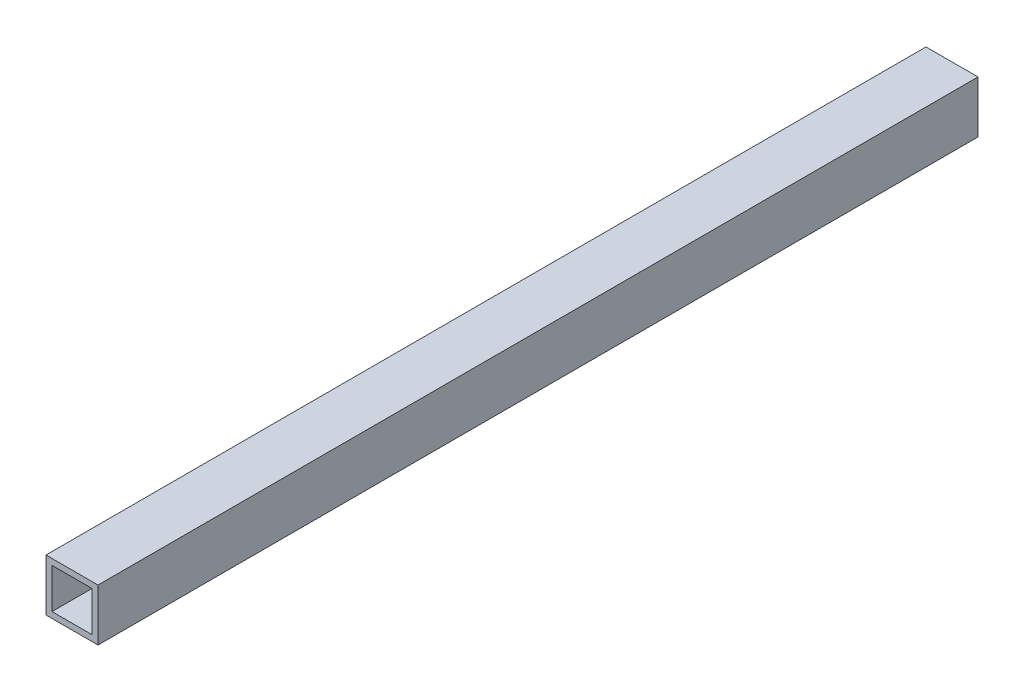
ISO-10303-21;
HEADER;
FILE_DESCRIPTION(('STEP AP214'),'2;1');
FILE_NAME('part.step','',(''),(''),'','','');
FILE_SCHEMA(('AUTOMOTIVE_DESIGN { 1 0 10303 214 1 1 1 1 }'));
ENDSEC;
DATA;
#1=APPLICATION_CONTEXT('core data for automotive mechanical design processes');
#2=APPLICATION_PROTOCOL_DEFINITION('international standard','automotive_design',2000,#1);
#3=PRODUCT_CONTEXT('',#1,'mechanical');
#4=PRODUCT('Part','Part','',(#3));
#5=PRODUCT_RELATED_PRODUCT_CATEGORY('part','',(#4));
#6=PRODUCT_DEFINITION_FORMATION('','',#4);
#7=PRODUCT_DEFINITION_CONTEXT('part definition',#1,'design');
#8=PRODUCT_DEFINITION('design','',#6,#7);
#9=PRODUCT_DEFINITION_SHAPE('','',#8);
#10=(LENGTH_UNIT() NAMED_UNIT(*) SI_UNIT(.MILLI.,.METRE.));
#11=(NAMED_UNIT(*) PLANE_ANGLE_UNIT() SI_UNIT($,.RADIAN.));
#12=(NAMED_UNIT(*) SI_UNIT($,.STERADIAN.) SOLID_ANGLE_UNIT());
#13=UNCERTAINTY_MEASURE_WITH_UNIT(LENGTH_MEASURE(1.E-05),#10,'distance_accuracy_value','');
#14=(GEOMETRIC_REPRESENTATION_CONTEXT(3) GLOBAL_UNCERTAINTY_ASSIGNED_CONTEXT((#13)) GLOBAL_UNIT_ASSIGNED_CONTEXT((#10,
#11,#12)) REPRESENTATION_CONTEXT('',''));
#15=CARTESIAN_POINT('',(0.,0.,0.));
#16=DIRECTION('',(0.,0.,1.));
#17=DIRECTION('',(1.,0.,0.));
#18=AXIS2_PLACEMENT_3D('',#15,#16,#17);
#19=CARTESIAN_POINT('',(0.,0.,220.));
#20=DIRECTION('',(0.,0.,1.));
#21=DIRECTION('',(1.,0.,0.));
#22=AXIS2_PLACEMENT_3D('',#19,#20,#21);
#23=PLANE('',#22);
#24=DIRECTION('',(0.,1.,0.));
#25=VECTOR('',#24,1.);
#26=CARTESIAN_POINT('',(6.5,6.5,220.));
#27=LINE('',#26,#25);
#28=CARTESIAN_POINT('',(6.5,-6.5,220.));
#29=VERTEX_POINT('',#28);
#30=CARTESIAN_POINT('',(6.5,6.5,220.));
#31=VERTEX_POINT('',#30);
#32=EDGE_CURVE('E136',#29,#31,#27,.T.);
#33=ORIENTED_EDGE('',*,*,#32,.T.);
#34=DIRECTION('',(-1.,0.,0.));
#35=VECTOR('',#34,1.);
#36=CARTESIAN_POINT('',(-6.5,6.5,220.));
#37=LINE('',#36,#35);
#38=CARTESIAN_POINT('',(-6.5,6.5,220.));
#39=VERTEX_POINT('',#38);
#40=EDGE_CURVE('E139',#31,#39,#37,.T.);
#41=ORIENTED_EDGE('',*,*,#40,.T.);
#42=DIRECTION('',(0.,-1.,0.));
#43=VECTOR('',#42,1.);
#44=CARTESIAN_POINT('',(-6.5,6.5,220.));
#45=LINE('',#44,#43);
#46=CARTESIAN_POINT('',(-6.5,-6.5,220.));
#47=VERTEX_POINT('',#46);
#48=EDGE_CURVE('E142',#39,#47,#45,.T.);
#49=ORIENTED_EDGE('',*,*,#48,.T.);
#50=DIRECTION('',(1.,0.,0.));
#51=VECTOR('',#50,1.);
#52=CARTESIAN_POINT('',(-6.5,-6.5,220.));
#53=LINE('',#52,#51);
#54=EDGE_CURVE('E144',#47,#29,#53,.T.);
#55=ORIENTED_EDGE('',*,*,#54,.T.);
#56=EDGE_LOOP('',(#33,#41,#49,#55));
#57=FACE_BOUND('',#56,.T.);
#58=DIRECTION('',(-1.,0.,0.));
#59=VECTOR('',#58,1.);
#60=CARTESIAN_POINT('',(-5.,5.00000000000001,220.));
#61=LINE('',#60,#59);
#62=CARTESIAN_POINT('',(5.,5.00000000000001,220.));
#63=VERTEX_POINT('',#62);
#64=CARTESIAN_POINT('',(-5.,5.00000000000001,220.));
#65=VERTEX_POINT('',#64);
#66=EDGE_CURVE('E108',#63,#65,#61,.T.);
#67=ORIENTED_EDGE('',*,*,#66,.F.);
#68=DIRECTION('',(0.,1.,0.));
#69=VECTOR('',#68,1.);
#70=CARTESIAN_POINT('',(5.,-5.,220.));
#71=LINE('',#70,#69);
#72=CARTESIAN_POINT('',(5.,-5.,220.));
#73=VERTEX_POINT('',#72);
#74=EDGE_CURVE('E100',#73,#63,#71,.T.);
#75=ORIENTED_EDGE('',*,*,#74,.F.);
#76=DIRECTION('',(1.,0.,0.));
#77=VECTOR('',#76,1.);
#78=CARTESIAN_POINT('',(-5.,-5.,220.));
#79=LINE('',#78,#77);
#80=CARTESIAN_POINT('',(-5.,-5.,220.));
#81=VERTEX_POINT('',#80);
#82=EDGE_CURVE('E122',#81,#73,#79,.T.);
#83=ORIENTED_EDGE('',*,*,#82,.F.);
#84=DIRECTION('',(0.,-1.,0.));
#85=VECTOR('',#84,1.);
#86=CARTESIAN_POINT('',(-5.,-5.,220.));
#87=LINE('',#86,#85);
#88=EDGE_CURVE('E120',#65,#81,#87,.T.);
#89=ORIENTED_EDGE('',*,*,#88,.F.);
#90=EDGE_LOOP('',(#67,#75,#83,#89));
#91=FACE_BOUND('',#90,.T.);
#92=ADVANCED_FACE('F35',(#57,#91),#23,.T.);
#93=CARTESIAN_POINT('',(0.,0.,0.));
#94=DIRECTION('',(0.,0.,1.));
#95=DIRECTION('',(1.,0.,0.));
#96=AXIS2_PLACEMENT_3D('',#93,#94,#95);
#97=PLANE('',#96);
#98=DIRECTION('',(0.,1.,0.));
#99=VECTOR('',#98,1.);
#100=CARTESIAN_POINT('',(6.5,6.5,0.));
#101=LINE('',#100,#99);
#102=CARTESIAN_POINT('',(6.5,-6.5,0.));
#103=VERTEX_POINT('',#102);
#104=CARTESIAN_POINT('',(6.5,6.5,0.));
#105=VERTEX_POINT('',#104);
#106=EDGE_CURVE('E116',#103,#105,#101,.T.);
#107=ORIENTED_EDGE('',*,*,#106,.F.);
#108=DIRECTION('',(1.,0.,0.));
#109=VECTOR('',#108,1.);
#110=CARTESIAN_POINT('',(-6.5,-6.5,0.));
#111=LINE('',#110,#109);
#112=CARTESIAN_POINT('',(-6.5,-6.5,0.));
#113=VERTEX_POINT('',#112);
#114=EDGE_CURVE('E140',#113,#103,#111,.T.);
#115=ORIENTED_EDGE('',*,*,#114,.F.);
#116=DIRECTION('',(0.,-1.,0.));
#117=VECTOR('',#116,1.);
#118=CARTESIAN_POINT('',(-6.5,6.5,0.));
#119=LINE('',#118,#117);
#120=CARTESIAN_POINT('',(-6.5,6.5,0.));
#121=VERTEX_POINT('',#120);
#122=EDGE_CURVE('E151',#121,#113,#119,.T.);
#123=ORIENTED_EDGE('',*,*,#122,.F.);
#124=DIRECTION('',(-1.,0.,0.));
#125=VECTOR('',#124,1.);
#126=CARTESIAN_POINT('',(-6.5,6.5,0.));
#127=LINE('',#126,#125);
#128=EDGE_CURVE('E149',#105,#121,#127,.T.);
#129=ORIENTED_EDGE('',*,*,#128,.F.);
#130=EDGE_LOOP('',(#107,#115,#123,#129));
#131=FACE_BOUND('',#130,.T.);
#132=DIRECTION('',(0.,1.,0.));
#133=VECTOR('',#132,1.);
#134=CARTESIAN_POINT('',(5.,-5.,0.));
#135=LINE('',#134,#133);
#136=CARTESIAN_POINT('',(5.,-5.,0.));
#137=VERTEX_POINT('',#136);
#138=CARTESIAN_POINT('',(5.,5.00000000000001,0.));
#139=VERTEX_POINT('',#138);
#140=EDGE_CURVE('E58',#137,#139,#135,.T.);
#141=ORIENTED_EDGE('',*,*,#140,.T.);
#142=DIRECTION('',(-1.,0.,0.));
#143=VECTOR('',#142,1.);
#144=CARTESIAN_POINT('',(-5.,5.00000000000001,0.));
#145=LINE('',#144,#143);
#146=CARTESIAN_POINT('',(-5.,5.00000000000001,0.));
#147=VERTEX_POINT('',#146);
#148=EDGE_CURVE('E115',#139,#147,#145,.T.);
#149=ORIENTED_EDGE('',*,*,#148,.T.);
#150=DIRECTION('',(0.,-1.,0.));
#151=VECTOR('',#150,1.);
#152=CARTESIAN_POINT('',(-5.,-5.,0.));
#153=LINE('',#152,#151);
#154=CARTESIAN_POINT('',(-5.,-5.,0.));
#155=VERTEX_POINT('',#154);
#156=EDGE_CURVE('E128',#147,#155,#153,.T.);
#157=ORIENTED_EDGE('',*,*,#156,.T.);
#158=DIRECTION('',(1.,0.,0.));
#159=VECTOR('',#158,1.);
#160=CARTESIAN_POINT('',(-5.,-5.,0.));
#161=LINE('',#160,#159);
#162=EDGE_CURVE('E109',#155,#137,#161,.T.);
#163=ORIENTED_EDGE('',*,*,#162,.T.);
#164=EDGE_LOOP('',(#141,#149,#157,#163));
#165=FACE_BOUND('',#164,.T.);
#166=ADVANCED_FACE('F169',(#131,#165),#97,.F.);
#167=CARTESIAN_POINT('',(6.5,6.5,220.));
#168=DIRECTION('',(-1.,0.,0.));
#169=DIRECTION('',(0.,0.,1.));
#170=AXIS2_PLACEMENT_3D('',#167,#168,#169);
#171=PLANE('',#170);
#172=ORIENTED_EDGE('',*,*,#106,.T.);
#173=DIRECTION('',(0.,0.,-1.));
#174=VECTOR('',#173,1.);
#175=CARTESIAN_POINT('',(6.5,6.5,220.));
#176=LINE('',#175,#174);
#177=EDGE_CURVE('E11',#31,#105,#176,.T.);
#178=ORIENTED_EDGE('',*,*,#177,.F.);
#179=ORIENTED_EDGE('',*,*,#32,.F.);
#180=DIRECTION('',(0.,0.,-1.));
#181=VECTOR('',#180,1.);
#182=CARTESIAN_POINT('',(6.5,-6.5,220.));
#183=LINE('',#182,#181);
#184=EDGE_CURVE('E146',#29,#103,#183,.T.);
#185=ORIENTED_EDGE('',*,*,#184,.T.);
#186=EDGE_LOOP('',(#172,#178,#179,#185));
#187=FACE_BOUND('',#186,.T.);
#188=ADVANCED_FACE('F37',(#187),#171,.F.);
#189=CARTESIAN_POINT('',(-6.5,6.5,220.));
#190=DIRECTION('',(0.,-1.,0.));
#191=DIRECTION('',(0.,0.,-1.));
#192=AXIS2_PLACEMENT_3D('',#189,#190,#191);
#193=PLANE('',#192);
#194=ORIENTED_EDGE('',*,*,#128,.T.);
#195=DIRECTION('',(0.,0.,-1.));
#196=VECTOR('',#195,1.);
#197=CARTESIAN_POINT('',(-6.5,6.5,220.));
#198=LINE('',#197,#196);
#199=EDGE_CURVE('E43',#39,#121,#198,.T.);
#200=ORIENTED_EDGE('',*,*,#199,.F.);
#201=ORIENTED_EDGE('',*,*,#40,.F.);
#202=ORIENTED_EDGE('',*,*,#177,.T.);
#203=EDGE_LOOP('',(#194,#200,#201,#202));
#204=FACE_BOUND('',#203,.T.);
#205=ADVANCED_FACE('F179',(#204),#193,.F.);
#206=CARTESIAN_POINT('',(-6.5,6.5,220.));
#207=DIRECTION('',(1.,0.,0.));
#208=DIRECTION('',(0.,0.,-1.));
#209=AXIS2_PLACEMENT_3D('',#206,#207,#208);
#210=PLANE('',#209);
#211=ORIENTED_EDGE('',*,*,#122,.T.);
#212=DIRECTION('',(0.,0.,-1.));
#213=VECTOR('',#212,1.);
#214=CARTESIAN_POINT('',(-6.5,-6.5,220.));
#215=LINE('',#214,#213);
#216=EDGE_CURVE('E156',#47,#113,#215,.T.);
#217=ORIENTED_EDGE('',*,*,#216,.F.);
#218=ORIENTED_EDGE('',*,*,#48,.F.);
#219=ORIENTED_EDGE('',*,*,#199,.T.);
#220=EDGE_LOOP('',(#211,#217,#218,#219));
#221=FACE_BOUND('',#220,.T.);
#222=ADVANCED_FACE('F163',(#221),#210,.F.);
#223=CARTESIAN_POINT('',(-6.5,-6.5,220.));
#224=DIRECTION('',(0.,1.,0.));
#225=DIRECTION('',(0.,0.,1.));
#226=AXIS2_PLACEMENT_3D('',#223,#224,#225);
#227=PLANE('',#226);
#228=ORIENTED_EDGE('',*,*,#114,.T.);
#229=ORIENTED_EDGE('',*,*,#184,.F.);
#230=ORIENTED_EDGE('',*,*,#54,.F.);
#231=ORIENTED_EDGE('',*,*,#216,.T.);
#232=EDGE_LOOP('',(#228,#229,#230,#231));
#233=FACE_BOUND('',#232,.T.);
#234=ADVANCED_FACE('F173',(#233),#227,.F.);
#235=CARTESIAN_POINT('',(5.,-5.,220.));
#236=DIRECTION('',(-1.,0.,0.));
#237=DIRECTION('',(0.,0.,1.));
#238=AXIS2_PLACEMENT_3D('',#235,#236,#237);
#239=PLANE('',#238);
#240=ORIENTED_EDGE('',*,*,#140,.F.);
#241=DIRECTION('',(0.,0.,-1.));
#242=VECTOR('',#241,1.);
#243=CARTESIAN_POINT('',(5.,-5.,220.));
#244=LINE('',#243,#242);
#245=EDGE_CURVE('E104',#73,#137,#244,.T.);
#246=ORIENTED_EDGE('',*,*,#245,.F.);
#247=ORIENTED_EDGE('',*,*,#74,.T.);
#248=DIRECTION('',(0.,0.,-1.));
#249=VECTOR('',#248,1.);
#250=CARTESIAN_POINT('',(5.,5.00000000000001,220.));
#251=LINE('',#250,#249);
#252=EDGE_CURVE('E103',#63,#139,#251,.T.);
#253=ORIENTED_EDGE('',*,*,#252,.T.);
#254=EDGE_LOOP('',(#240,#246,#247,#253));
#255=FACE_BOUND('',#254,.T.);
#256=ADVANCED_FACE('F102',(#255),#239,.T.);
#257=CARTESIAN_POINT('',(-5.,5.00000000000001,220.));
#258=DIRECTION('',(0.,-1.,0.));
#259=DIRECTION('',(0.,0.,-1.));
#260=AXIS2_PLACEMENT_3D('',#257,#258,#259);
#261=PLANE('',#260);
#262=ORIENTED_EDGE('',*,*,#148,.F.);
#263=ORIENTED_EDGE('',*,*,#252,.F.);
#264=ORIENTED_EDGE('',*,*,#66,.T.);
#265=DIRECTION('',(0.,0.,-1.));
#266=VECTOR('',#265,1.);
#267=CARTESIAN_POINT('',(-5.,5.00000000000001,220.));
#268=LINE('',#267,#266);
#269=EDGE_CURVE('E117',#65,#147,#268,.T.);
#270=ORIENTED_EDGE('',*,*,#269,.T.);
#271=EDGE_LOOP('',(#262,#263,#264,#270));
#272=FACE_BOUND('',#271,.T.);
#273=ADVANCED_FACE('F112',(#272),#261,.T.);
#274=CARTESIAN_POINT('',(-5.,-5.,220.));
#275=DIRECTION('',(1.,0.,0.));
#276=DIRECTION('',(0.,0.,-1.));
#277=AXIS2_PLACEMENT_3D('',#274,#275,#276);
#278=PLANE('',#277);
#279=ORIENTED_EDGE('',*,*,#156,.F.);
#280=ORIENTED_EDGE('',*,*,#269,.F.);
#281=ORIENTED_EDGE('',*,*,#88,.T.);
#282=DIRECTION('',(0.,0.,-1.));
#283=VECTOR('',#282,1.);
#284=CARTESIAN_POINT('',(-5.,-5.,220.));
#285=LINE('',#284,#283);
#286=EDGE_CURVE('E50',#81,#155,#285,.T.);
#287=ORIENTED_EDGE('',*,*,#286,.T.);
#288=EDGE_LOOP('',(#279,#280,#281,#287));
#289=FACE_BOUND('',#288,.T.);
#290=ADVANCED_FACE('F202',(#289),#278,.T.);
#291=CARTESIAN_POINT('',(-5.,-5.,220.));
#292=DIRECTION('',(0.,1.,0.));
#293=DIRECTION('',(0.,0.,1.));
#294=AXIS2_PLACEMENT_3D('',#291,#292,#293);
#295=PLANE('',#294);
#296=ORIENTED_EDGE('',*,*,#162,.F.);
#297=ORIENTED_EDGE('',*,*,#286,.F.);
#298=ORIENTED_EDGE('',*,*,#82,.T.);
#299=ORIENTED_EDGE('',*,*,#245,.T.);
#300=EDGE_LOOP('',(#296,#297,#298,#299));
#301=FACE_BOUND('',#300,.T.);
#302=ADVANCED_FACE('F206',(#301),#295,.T.);
#303=CLOSED_SHELL('',(#92,#166,#188,#205,#222,#234,#256,#273,#290,#302));
#304=MANIFOLD_SOLID_BREP('B2',#303);
#305=ADVANCED_BREP_SHAPE_REPRESENTATION('',(#18,#304),#14);
#306=SHAPE_DEFINITION_REPRESENTATION(#9,#305);
ENDSEC;
END-ISO-10303-21;
